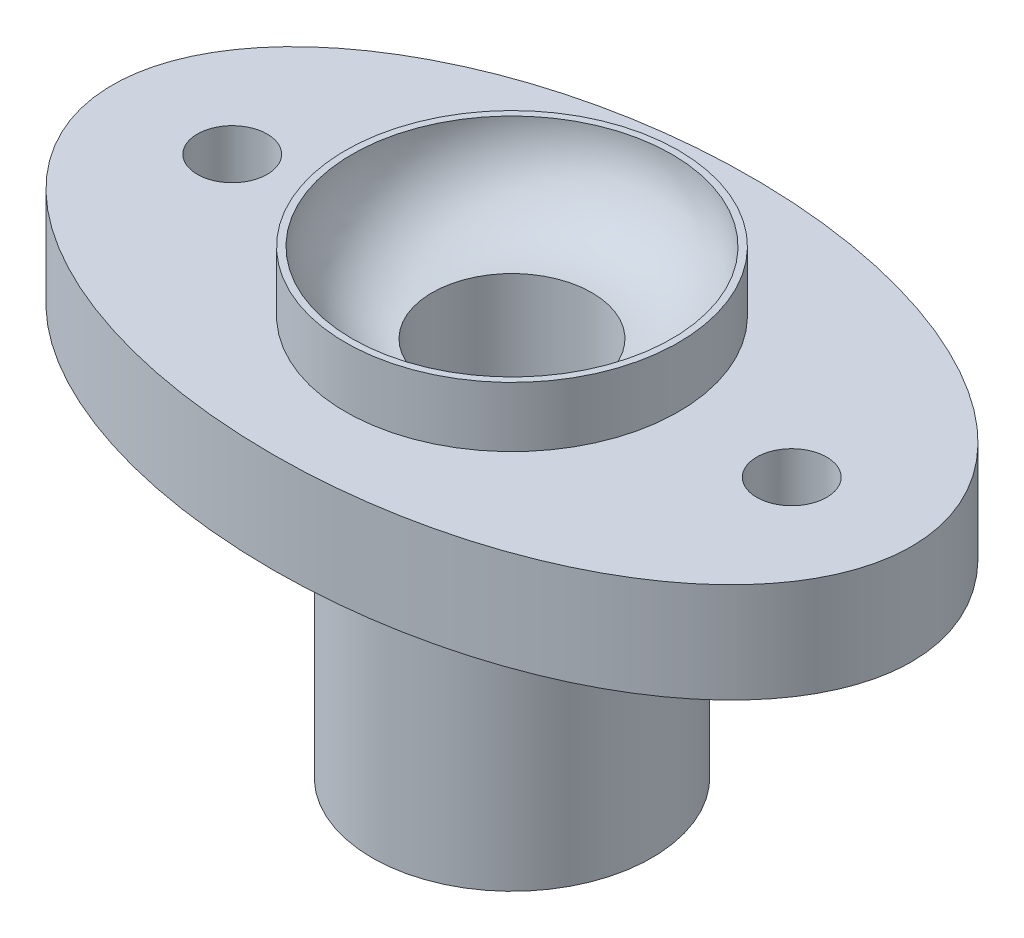
ISO-10303-21;
HEADER;
FILE_DESCRIPTION(('STEP AP214'),'2;1');
FILE_NAME('part.step','',(''),(''),'','','');
FILE_SCHEMA(('AUTOMOTIVE_DESIGN { 1 0 10303 214 1 1 1 1 }'));
ENDSEC;
DATA;
#1=APPLICATION_CONTEXT('core data for automotive mechanical design processes');
#2=APPLICATION_PROTOCOL_DEFINITION('international standard','automotive_design',2000,#1);
#3=PRODUCT_CONTEXT('',#1,'mechanical');
#4=PRODUCT('Part','Part','',(#3));
#5=PRODUCT_RELATED_PRODUCT_CATEGORY('part','',(#4));
#6=PRODUCT_DEFINITION_FORMATION('','',#4);
#7=PRODUCT_DEFINITION_CONTEXT('part definition',#1,'design');
#8=PRODUCT_DEFINITION('design','',#6,#7);
#9=PRODUCT_DEFINITION_SHAPE('','',#8);
#10=(LENGTH_UNIT() NAMED_UNIT(*) SI_UNIT(.MILLI.,.METRE.));
#11=(NAMED_UNIT(*) PLANE_ANGLE_UNIT() SI_UNIT($,.RADIAN.));
#12=(NAMED_UNIT(*) SI_UNIT($,.STERADIAN.) SOLID_ANGLE_UNIT());
#13=UNCERTAINTY_MEASURE_WITH_UNIT(LENGTH_MEASURE(1.E-05),#10,'distance_accuracy_value','');
#14=(GEOMETRIC_REPRESENTATION_CONTEXT(3) GLOBAL_UNCERTAINTY_ASSIGNED_CONTEXT((#13)) GLOBAL_UNIT_ASSIGNED_CONTEXT((#10,
#11,#12)) REPRESENTATION_CONTEXT('',''));
#15=CARTESIAN_POINT('',(0.,0.,0.));
#16=DIRECTION('',(0.,0.,1.));
#17=DIRECTION('',(1.,0.,0.));
#18=AXIS2_PLACEMENT_3D('',#15,#16,#17);
#19=CARTESIAN_POINT('',(0.,45.,0.));
#20=DIRECTION('',(0.,-1.,0.));
#21=DIRECTION('',(0.,0.,-1.));
#22=AXIS2_PLACEMENT_3D('',#19,#20,#21);
#23=PLANE('',#22);
#24=CARTESIAN_POINT('',(42.,45.,0.));
#25=DIRECTION('',(0.,-1.,0.));
#26=DIRECTION('',(0.,0.,-1.));
#27=AXIS2_PLACEMENT_3D('',#24,#25,#26);
#28=CIRCLE('',#27,5.25);
#29=CARTESIAN_POINT('',(42.,45.,-5.25));
#30=VERTEX_POINT('',#29);
#31=EDGE_CURVE('E198',#30,#30,#28,.F.);
#32=ORIENTED_EDGE('',*,*,#31,.T.);
#33=EDGE_LOOP('',(#32));
#34=FACE_BOUND('',#33,.T.);
#35=CARTESIAN_POINT('',(-42.,45.,0.));
#36=DIRECTION('',(0.,-1.,0.));
#37=DIRECTION('',(0.,0.,-1.));
#38=AXIS2_PLACEMENT_3D('',#35,#36,#37);
#39=CIRCLE('',#38,5.25);
#40=CARTESIAN_POINT('',(-42.,45.,-5.25));
#41=VERTEX_POINT('',#40);
#42=EDGE_CURVE('E73',#41,#41,#39,.F.);
#43=ORIENTED_EDGE('',*,*,#42,.T.);
#44=EDGE_LOOP('',(#43));
#45=FACE_BOUND('',#44,.T.);
#46=CARTESIAN_POINT('',(0.,45.,0.));
#47=DIRECTION('',(0.,-1.,0.));
#48=DIRECTION('',(0.,0.,-1.));
#49=AXIS2_PLACEMENT_3D('',#46,#47,#48);
#50=CIRCLE('',#49,21.);
#51=CARTESIAN_POINT('',(0.,45.,-21.));
#52=VERTEX_POINT('',#51);
#53=EDGE_CURVE('E55',#52,#52,#50,.T.);
#54=ORIENTED_EDGE('',*,*,#53,.F.);
#55=EDGE_LOOP('',(#54));
#56=FACE_BOUND('',#55,.T.);
#57=CARTESIAN_POINT('',(0.,45.,0.));
#58=DIRECTION('',(0.,1.,0.));
#59=DIRECTION('',(1.,0.,0.));
#60=AXIS2_PLACEMENT_3D('',#57,#58,#59);
#61=ELLIPSE('',#60,60.,36.);
#62=CARTESIAN_POINT('',(60.,45.,0.));
#63=VERTEX_POINT('',#62);
#64=EDGE_CURVE('E64',#63,#63,#61,.F.);
#65=ORIENTED_EDGE('',*,*,#64,.T.);
#66=EDGE_LOOP('',(#65));
#67=FACE_BOUND('',#66,.T.);
#68=ADVANCED_FACE('F35',(#34,#45,#56,#67),#23,.T.);
#69=CARTESIAN_POINT('',(0.,60.,0.));
#70=DIRECTION('',(0.,1.,0.));
#71=DIRECTION('',(0.,0.,1.));
#72=AXIS2_PLACEMENT_3D('',#69,#70,#71);
#73=PLANE('',#72);
#74=CARTESIAN_POINT('',(42.,60.,0.));
#75=DIRECTION('',(0.,1.,0.));
#76=DIRECTION('',(0.,0.,1.));
#77=AXIS2_PLACEMENT_3D('',#74,#75,#76);
#78=CIRCLE('',#77,5.25);
#79=CARTESIAN_POINT('',(42.,60.,5.25));
#80=VERTEX_POINT('',#79);
#81=EDGE_CURVE('E70',#80,#80,#78,.T.);
#82=ORIENTED_EDGE('',*,*,#81,.F.);
#83=EDGE_LOOP('',(#82));
#84=FACE_BOUND('',#83,.T.);
#85=CARTESIAN_POINT('',(-42.,60.,0.));
#86=DIRECTION('',(0.,1.,0.));
#87=DIRECTION('',(0.,0.,-1.));
#88=AXIS2_PLACEMENT_3D('',#85,#86,#87);
#89=CIRCLE('',#88,5.25);
#90=CARTESIAN_POINT('',(-42.,60.,-5.25));
#91=VERTEX_POINT('',#90);
#92=EDGE_CURVE('E202',#91,#91,#89,.T.);
#93=ORIENTED_EDGE('',*,*,#92,.F.);
#94=EDGE_LOOP('',(#93));
#95=FACE_BOUND('',#94,.T.);
#96=CARTESIAN_POINT('',(0.,60.,0.));
#97=DIRECTION('',(0.,-1.,0.));
#98=DIRECTION('',(0.,0.,-1.));
#99=AXIS2_PLACEMENT_3D('',#96,#97,#98);
#100=CIRCLE('',#99,25.);
#101=CARTESIAN_POINT('',(0.,60.,-25.));
#102=VERTEX_POINT('',#101);
#103=EDGE_CURVE('E58',#102,#102,#100,.T.);
#104=ORIENTED_EDGE('',*,*,#103,.T.);
#105=EDGE_LOOP('',(#104));
#106=FACE_BOUND('',#105,.T.);
#107=CARTESIAN_POINT('',(0.,60.,0.));
#108=DIRECTION('',(0.,1.,0.));
#109=DIRECTION('',(1.,0.,0.));
#110=AXIS2_PLACEMENT_3D('',#107,#108,#109);
#111=ELLIPSE('',#110,60.,36.);
#112=CARTESIAN_POINT('',(60.,60.,0.));
#113=VERTEX_POINT('',#112);
#114=EDGE_CURVE('E67',#113,#113,#111,.T.);
#115=ORIENTED_EDGE('',*,*,#114,.T.);
#116=EDGE_LOOP('',(#115));
#117=FACE_BOUND('',#116,.T.);
#118=ADVANCED_FACE('F88',(#84,#95,#106,#117),#73,.T.);
#119=CARTESIAN_POINT('',(0.,69.,0.));
#120=DIRECTION('',(0.,1.,0.));
#121=DIRECTION('',(0.,0.,1.));
#122=AXIS2_PLACEMENT_3D('',#119,#120,#121);
#123=PLANE('',#122);
#124=CARTESIAN_POINT('',(0.,69.,0.));
#125=DIRECTION('',(0.,-1.,0.));
#126=DIRECTION('',(0.,0.,-1.));
#127=AXIS2_PLACEMENT_3D('',#124,#125,#126);
#128=CIRCLE('',#127,24.);
#129=CARTESIAN_POINT('',(0.,69.,-24.));
#130=VERTEX_POINT('',#129);
#131=EDGE_CURVE('E10',#130,#130,#128,.T.);
#132=ORIENTED_EDGE('',*,*,#131,.T.);
#133=EDGE_LOOP('',(#132));
#134=FACE_BOUND('',#133,.T.);
#135=CARTESIAN_POINT('',(0.,69.,0.));
#136=DIRECTION('',(0.,-1.,0.));
#137=DIRECTION('',(0.,0.,-1.));
#138=AXIS2_PLACEMENT_3D('',#135,#136,#137);
#139=CIRCLE('',#138,25.);
#140=CARTESIAN_POINT('',(0.,69.,-25.));
#141=VERTEX_POINT('',#140);
#142=EDGE_CURVE('E61',#141,#141,#139,.T.);
#143=ORIENTED_EDGE('',*,*,#142,.F.);
#144=EDGE_LOOP('',(#143));
#145=FACE_BOUND('',#144,.T.);
#146=ADVANCED_FACE('F37',(#134,#145),#123,.T.);
#147=CARTESIAN_POINT('',(0.,69.,0.));
#148=DIRECTION('',(0.,-1.,0.));
#149=DIRECTION('',(0.,0.,-1.));
#150=AXIS2_PLACEMENT_3D('',#147,#148,#149);
#151=TOROIDAL_SURFACE('',#150,12.,12.);
#152=CARTESIAN_POINT('',(0.,57.,0.));
#153=DIRECTION('',(0.,-1.,0.));
#154=DIRECTION('',(0.,0.,-1.));
#155=AXIS2_PLACEMENT_3D('',#152,#153,#154);
#156=CIRCLE('',#155,12.);
#157=CARTESIAN_POINT('',(0.,57.,-12.));
#158=VERTEX_POINT('',#157);
#159=EDGE_CURVE('E42',#158,#158,#156,.T.);
#160=ORIENTED_EDGE('',*,*,#159,.T.);
#161=EDGE_LOOP('',(#160));
#162=FACE_BOUND('',#161,.T.);
#163=ORIENTED_EDGE('',*,*,#131,.F.);
#164=EDGE_LOOP('',(#163));
#165=FACE_BOUND('',#164,.T.);
#166=ADVANCED_FACE('F104',(#162,#165),#151,.F.);
#167=CARTESIAN_POINT('',(0.,0.,0.));
#168=DIRECTION('',(0.,-1.,0.));
#169=DIRECTION('',(0.,0.,-1.));
#170=AXIS2_PLACEMENT_3D('',#167,#168,#169);
#171=CYLINDRICAL_SURFACE('',#170,12.);
#172=CARTESIAN_POINT('',(0.,2.41154273188004,0.));
#173=DIRECTION('',(0.,-1.,0.));
#174=DIRECTION('',(0.,0.,-1.));
#175=AXIS2_PLACEMENT_3D('',#172,#173,#174);
#176=CIRCLE('',#175,12.);
#177=CARTESIAN_POINT('',(0.,2.41154273188004,-12.));
#178=VERTEX_POINT('',#177);
#179=EDGE_CURVE('E46',#178,#178,#176,.T.);
#180=ORIENTED_EDGE('',*,*,#179,.T.);
#181=EDGE_LOOP('',(#180));
#182=FACE_BOUND('',#181,.T.);
#183=ORIENTED_EDGE('',*,*,#159,.F.);
#184=EDGE_LOOP('',(#183));
#185=FACE_BOUND('',#184,.T.);
#186=ADVANCED_FACE('F101',(#182,#185),#171,.F.);
#187=CARTESIAN_POINT('',(0.,0.,0.));
#188=DIRECTION('',(0.,-1.,0.));
#189=DIRECTION('',(0.,0.,-1.));
#190=AXIS2_PLACEMENT_3D('',#187,#188,#189);
#191=CONICAL_SURFACE('',#190,21.,1.30899693899575);
#192=ORIENTED_EDGE('',*,*,#179,.F.);
#193=EDGE_LOOP('',(#192));
#194=FACE_BOUND('',#193,.T.);
#195=CARTESIAN_POINT('',(0.,0.,0.));
#196=DIRECTION('',(0.,-1.,0.));
#197=DIRECTION('',(0.,0.,-1.));
#198=AXIS2_PLACEMENT_3D('',#195,#196,#197);
#199=CIRCLE('',#198,21.);
#200=CARTESIAN_POINT('',(0.,0.,-21.));
#201=VERTEX_POINT('',#200);
#202=EDGE_CURVE('E50',#201,#201,#199,.T.);
#203=ORIENTED_EDGE('',*,*,#202,.T.);
#204=EDGE_LOOP('',(#203));
#205=FACE_BOUND('',#204,.T.);
#206=ADVANCED_FACE('F97',(#194,#205),#191,.F.);
#207=CARTESIAN_POINT('',(0.,0.,0.));
#208=DIRECTION('',(0.,-1.,0.));
#209=DIRECTION('',(0.,0.,-1.));
#210=AXIS2_PLACEMENT_3D('',#207,#208,#209);
#211=CYLINDRICAL_SURFACE('',#210,21.);
#212=ORIENTED_EDGE('',*,*,#53,.T.);
#213=EDGE_LOOP('',(#212));
#214=FACE_BOUND('',#213,.T.);
#215=ORIENTED_EDGE('',*,*,#202,.F.);
#216=EDGE_LOOP('',(#215));
#217=FACE_BOUND('',#216,.T.);
#218=ADVANCED_FACE('F86',(#214,#217),#211,.T.);
#219=CARTESIAN_POINT('',(0.,0.,0.));
#220=DIRECTION('',(0.,-1.,0.));
#221=DIRECTION('',(0.,0.,-1.));
#222=AXIS2_PLACEMENT_3D('',#219,#220,#221);
#223=CYLINDRICAL_SURFACE('',#222,25.);
#224=ORIENTED_EDGE('',*,*,#142,.T.);
#225=EDGE_LOOP('',(#224));
#226=FACE_BOUND('',#225,.T.);
#227=ORIENTED_EDGE('',*,*,#103,.F.);
#228=EDGE_LOOP('',(#227));
#229=FACE_BOUND('',#228,.T.);
#230=ADVANCED_FACE('F81',(#226,#229),#223,.T.);
#231=CARTESIAN_POINT('',(0.,0.,0.));
#232=DIRECTION('',(0.,1.,0.));
#233=DIRECTION('',(1.,0.,0.));
#234=AXIS2_PLACEMENT_3D('',#231,#232,#233);
#235=ELLIPSE('',#234,60.,36.);
#236=DIRECTION('',(0.,1.,0.));
#237=VECTOR('',#236,1.);
#238=SURFACE_OF_LINEAR_EXTRUSION('',#235,#237);
#239=ORIENTED_EDGE('',*,*,#114,.F.);
#240=EDGE_LOOP('',(#239));
#241=FACE_BOUND('',#240,.T.);
#242=ORIENTED_EDGE('',*,*,#64,.F.);
#243=EDGE_LOOP('',(#242));
#244=FACE_BOUND('',#243,.T.);
#245=ADVANCED_FACE('F76',(#241,#244),#238,.T.);
#246=CARTESIAN_POINT('',(-42.,-0.001000000000001,0.));
#247=DIRECTION('',(0.,1.,0.));
#248=DIRECTION('',(0.,0.,1.));
#249=AXIS2_PLACEMENT_3D('',#246,#247,#248);
#250=CYLINDRICAL_SURFACE('',#249,5.25);
#251=ORIENTED_EDGE('',*,*,#42,.F.);
#252=EDGE_LOOP('',(#251));
#253=FACE_BOUND('',#252,.T.);
#254=ORIENTED_EDGE('',*,*,#92,.T.);
#255=EDGE_LOOP('',(#254));
#256=FACE_BOUND('',#255,.T.);
#257=ADVANCED_FACE('F80',(#253,#256),#250,.F.);
#258=CARTESIAN_POINT('',(42.,-0.001000000000001,0.));
#259=DIRECTION('',(0.,1.,0.));
#260=DIRECTION('',(0.,0.,1.));
#261=AXIS2_PLACEMENT_3D('',#258,#259,#260);
#262=CYLINDRICAL_SURFACE('',#261,5.25);
#263=ORIENTED_EDGE('',*,*,#31,.F.);
#264=EDGE_LOOP('',(#263));
#265=FACE_BOUND('',#264,.T.);
#266=ORIENTED_EDGE('',*,*,#81,.T.);
#267=EDGE_LOOP('',(#266));
#268=FACE_BOUND('',#267,.T.);
#269=ADVANCED_FACE('F180',(#265,#268),#262,.F.);
#270=CLOSED_SHELL('',(#68,#118,#146,#166,#186,#206,#218,#230,#245,#257,#269));
#271=MANIFOLD_SOLID_BREP('B2',#270);
#272=ADVANCED_BREP_SHAPE_REPRESENTATION('',(#18,#271),#14);
#273=SHAPE_DEFINITION_REPRESENTATION(#9,#272);
ENDSEC;
END-ISO-10303-21;
